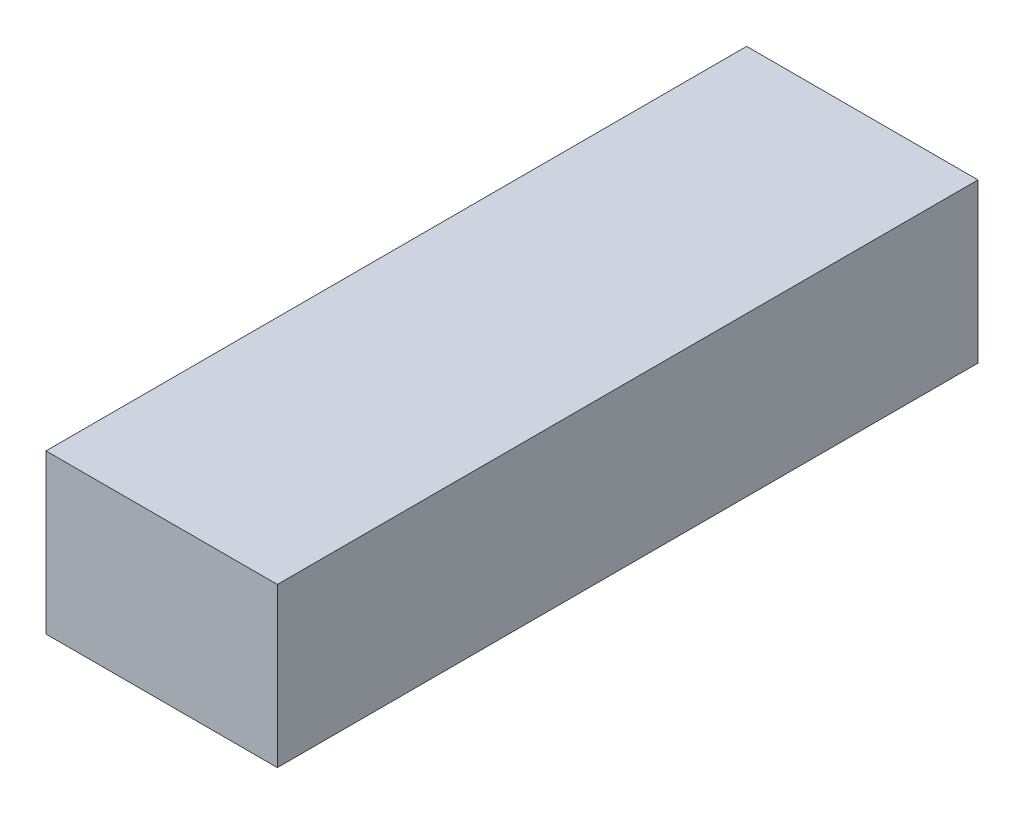
ISO-10303-21;
HEADER;
FILE_DESCRIPTION(('STEP AP214'),'2;1');
FILE_NAME('part.step','',(''),(''),'','','');
FILE_SCHEMA(('AUTOMOTIVE_DESIGN { 1 0 10303 214 1 1 1 1 }'));
ENDSEC;
DATA;
#1=APPLICATION_CONTEXT('core data for automotive mechanical design processes');
#2=APPLICATION_PROTOCOL_DEFINITION('international standard','automotive_design',2000,#1);
#3=PRODUCT_CONTEXT('',#1,'mechanical');
#4=PRODUCT('Part','Part','',(#3));
#5=PRODUCT_RELATED_PRODUCT_CATEGORY('part','',(#4));
#6=PRODUCT_DEFINITION_FORMATION('','',#4);
#7=PRODUCT_DEFINITION_CONTEXT('part definition',#1,'design');
#8=PRODUCT_DEFINITION('design','',#6,#7);
#9=PRODUCT_DEFINITION_SHAPE('','',#8);
#10=(LENGTH_UNIT() NAMED_UNIT(*) SI_UNIT(.MILLI.,.METRE.));
#11=(NAMED_UNIT(*) PLANE_ANGLE_UNIT() SI_UNIT($,.RADIAN.));
#12=(NAMED_UNIT(*) SI_UNIT($,.STERADIAN.) SOLID_ANGLE_UNIT());
#13=UNCERTAINTY_MEASURE_WITH_UNIT(LENGTH_MEASURE(1.E-05),#10,'distance_accuracy_value','');
#14=(GEOMETRIC_REPRESENTATION_CONTEXT(3) GLOBAL_UNCERTAINTY_ASSIGNED_CONTEXT((#13)) GLOBAL_UNIT_ASSIGNED_CONTEXT((#10,
#11,#12)) REPRESENTATION_CONTEXT('',''));
#15=CARTESIAN_POINT('',(0.,0.,0.));
#16=DIRECTION('',(0.,0.,1.));
#17=DIRECTION('',(1.,0.,0.));
#18=AXIS2_PLACEMENT_3D('',#15,#16,#17);
#19=CARTESIAN_POINT('',(17.5,-12.,106.));
#20=DIRECTION('',(-1.,0.,0.));
#21=DIRECTION('',(0.,0.,1.));
#22=AXIS2_PLACEMENT_3D('',#19,#20,#21);
#23=PLANE('',#22);
#24=DIRECTION('',(0.,1.,0.));
#25=VECTOR('',#24,1.);
#26=CARTESIAN_POINT('',(17.5,-12.,0.));
#27=LINE('',#26,#25);
#28=CARTESIAN_POINT('',(17.5,-12.,0.));
#29=VERTEX_POINT('',#28);
#30=CARTESIAN_POINT('',(17.5,12.,0.));
#31=VERTEX_POINT('',#30);
#32=EDGE_CURVE('E109',#29,#31,#27,.T.);
#33=ORIENTED_EDGE('',*,*,#32,.T.);
#34=DIRECTION('',(0.,0.,-1.));
#35=VECTOR('',#34,1.);
#36=CARTESIAN_POINT('',(17.5,12.,106.));
#37=LINE('',#36,#35);
#38=CARTESIAN_POINT('',(17.5,12.,106.));
#39=VERTEX_POINT('',#38);
#40=EDGE_CURVE('E11',#39,#31,#37,.T.);
#41=ORIENTED_EDGE('',*,*,#40,.F.);
#42=DIRECTION('',(0.,1.,0.));
#43=VECTOR('',#42,1.);
#44=CARTESIAN_POINT('',(17.5,-12.,106.));
#45=LINE('',#44,#43);
#46=CARTESIAN_POINT('',(17.5,-12.,106.));
#47=VERTEX_POINT('',#46);
#48=EDGE_CURVE('E93',#47,#39,#45,.T.);
#49=ORIENTED_EDGE('',*,*,#48,.F.);
#50=DIRECTION('',(0.,0.,-1.));
#51=VECTOR('',#50,1.);
#52=CARTESIAN_POINT('',(17.5,-12.,106.));
#53=LINE('',#52,#51);
#54=EDGE_CURVE('E105',#47,#29,#53,.T.);
#55=ORIENTED_EDGE('',*,*,#54,.T.);
#56=EDGE_LOOP('',(#33,#41,#49,#55));
#57=FACE_BOUND('',#56,.T.);
#58=ADVANCED_FACE('F41',(#57),#23,.F.);
#59=CARTESIAN_POINT('',(-17.5,12.,106.));
#60=DIRECTION('',(0.,-1.,0.));
#61=DIRECTION('',(0.,0.,-1.));
#62=AXIS2_PLACEMENT_3D('',#59,#60,#61);
#63=PLANE('',#62);
#64=DIRECTION('',(-1.,0.,0.));
#65=VECTOR('',#64,1.);
#66=CARTESIAN_POINT('',(-17.5,12.,0.));
#67=LINE('',#66,#65);
#68=CARTESIAN_POINT('',(-17.5,12.,0.));
#69=VERTEX_POINT('',#68);
#70=EDGE_CURVE('E98',#31,#69,#67,.T.);
#71=ORIENTED_EDGE('',*,*,#70,.T.);
#72=DIRECTION('',(0.,0.,-1.));
#73=VECTOR('',#72,1.);
#74=CARTESIAN_POINT('',(-17.5,12.,106.));
#75=LINE('',#74,#73);
#76=CARTESIAN_POINT('',(-17.5,12.,106.));
#77=VERTEX_POINT('',#76);
#78=EDGE_CURVE('E50',#77,#69,#75,.T.);
#79=ORIENTED_EDGE('',*,*,#78,.F.);
#80=DIRECTION('',(-1.,0.,0.));
#81=VECTOR('',#80,1.);
#82=CARTESIAN_POINT('',(-17.5,12.,106.));
#83=LINE('',#82,#81);
#84=EDGE_CURVE('E88',#39,#77,#83,.T.);
#85=ORIENTED_EDGE('',*,*,#84,.F.);
#86=ORIENTED_EDGE('',*,*,#40,.T.);
#87=EDGE_LOOP('',(#71,#79,#85,#86));
#88=FACE_BOUND('',#87,.T.);
#89=ADVANCED_FACE('F97',(#88),#63,.F.);
#90=CARTESIAN_POINT('',(-17.5,-12.,106.));
#91=DIRECTION('',(1.,0.,0.));
#92=DIRECTION('',(0.,0.,-1.));
#93=AXIS2_PLACEMENT_3D('',#90,#91,#92);
#94=PLANE('',#93);
#95=DIRECTION('',(0.,-1.,0.));
#96=VECTOR('',#95,1.);
#97=CARTESIAN_POINT('',(-17.5,-12.,0.));
#98=LINE('',#97,#96);
#99=CARTESIAN_POINT('',(-17.5,-12.,0.));
#100=VERTEX_POINT('',#99);
#101=EDGE_CURVE('E75',#69,#100,#98,.T.);
#102=ORIENTED_EDGE('',*,*,#101,.T.);
#103=DIRECTION('',(0.,0.,-1.));
#104=VECTOR('',#103,1.);
#105=CARTESIAN_POINT('',(-17.5,-12.,106.));
#106=LINE('',#105,#104);
#107=CARTESIAN_POINT('',(-17.5,-12.,106.));
#108=VERTEX_POINT('',#107);
#109=EDGE_CURVE('E100',#108,#100,#106,.T.);
#110=ORIENTED_EDGE('',*,*,#109,.F.);
#111=DIRECTION('',(0.,-1.,0.));
#112=VECTOR('',#111,1.);
#113=CARTESIAN_POINT('',(-17.5,-12.,106.));
#114=LINE('',#113,#112);
#115=EDGE_CURVE('E91',#77,#108,#114,.T.);
#116=ORIENTED_EDGE('',*,*,#115,.F.);
#117=ORIENTED_EDGE('',*,*,#78,.T.);
#118=EDGE_LOOP('',(#102,#110,#116,#117));
#119=FACE_BOUND('',#118,.T.);
#120=ADVANCED_FACE('F101',(#119),#94,.F.);
#121=CARTESIAN_POINT('',(-17.5,-12.,106.));
#122=DIRECTION('',(0.,1.,0.));
#123=DIRECTION('',(0.,0.,1.));
#124=AXIS2_PLACEMENT_3D('',#121,#122,#123);
#125=PLANE('',#124);
#126=DIRECTION('',(1.,0.,0.));
#127=VECTOR('',#126,1.);
#128=CARTESIAN_POINT('',(-17.5,-12.,0.));
#129=LINE('',#128,#127);
#130=EDGE_CURVE('E81',#100,#29,#129,.T.);
#131=ORIENTED_EDGE('',*,*,#130,.T.);
#132=ORIENTED_EDGE('',*,*,#54,.F.);
#133=DIRECTION('',(1.,0.,0.));
#134=VECTOR('',#133,1.);
#135=CARTESIAN_POINT('',(-17.5,-12.,106.));
#136=LINE('',#135,#134);
#137=EDGE_CURVE('E58',#108,#47,#136,.T.);
#138=ORIENTED_EDGE('',*,*,#137,.F.);
#139=ORIENTED_EDGE('',*,*,#109,.T.);
#140=EDGE_LOOP('',(#131,#132,#138,#139));
#141=FACE_BOUND('',#140,.T.);
#142=ADVANCED_FACE('F122',(#141),#125,.F.);
#143=CARTESIAN_POINT('',(0.,0.,106.));
#144=DIRECTION('',(0.,0.,-1.));
#145=DIRECTION('',(-1.,0.,0.));
#146=AXIS2_PLACEMENT_3D('',#143,#144,#145);
#147=PLANE('',#146);
#148=ORIENTED_EDGE('',*,*,#48,.T.);
#149=ORIENTED_EDGE('',*,*,#84,.T.);
#150=ORIENTED_EDGE('',*,*,#115,.T.);
#151=ORIENTED_EDGE('',*,*,#137,.T.);
#152=EDGE_LOOP('',(#148,#149,#150,#151));
#153=FACE_BOUND('',#152,.T.);
#154=ADVANCED_FACE('F89',(#153),#147,.F.);
#155=CARTESIAN_POINT('',(0.,0.,0.));
#156=DIRECTION('',(0.,0.,-1.));
#157=DIRECTION('',(-1.,0.,0.));
#158=AXIS2_PLACEMENT_3D('',#155,#156,#157);
#159=PLANE('',#158);
#160=ORIENTED_EDGE('',*,*,#32,.F.);
#161=ORIENTED_EDGE('',*,*,#130,.F.);
#162=ORIENTED_EDGE('',*,*,#101,.F.);
#163=ORIENTED_EDGE('',*,*,#70,.F.);
#164=EDGE_LOOP('',(#160,#161,#162,#163));
#165=FACE_BOUND('',#164,.T.);
#166=ADVANCED_FACE('F125',(#165),#159,.T.);
#167=CLOSED_SHELL('',(#58,#89,#120,#142,#154,#166));
#168=MANIFOLD_SOLID_BREP('B2',#167);
#169=ADVANCED_BREP_SHAPE_REPRESENTATION('',(#18,#168),#14);
#170=SHAPE_DEFINITION_REPRESENTATION(#9,#169);
ENDSEC;
END-ISO-10303-21;
